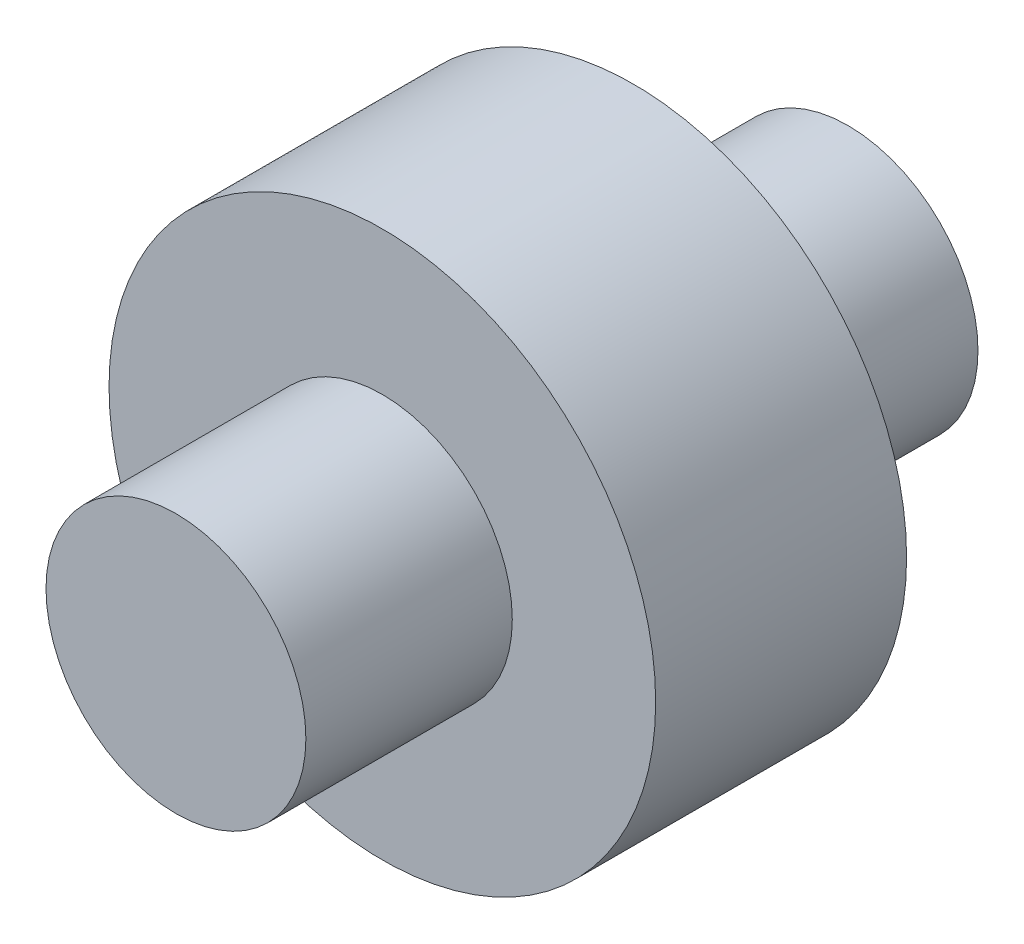
ISO-10303-21;
HEADER;
FILE_DESCRIPTION(('STEP AP214'),'2;1');
FILE_NAME('part.step','',(''),(''),'','','');
FILE_SCHEMA(('AUTOMOTIVE_DESIGN { 1 0 10303 214 1 1 1 1 }'));
ENDSEC;
DATA;
#1=APPLICATION_CONTEXT('core data for automotive mechanical design processes');
#2=APPLICATION_PROTOCOL_DEFINITION('international standard','automotive_design',2000,#1);
#3=PRODUCT_CONTEXT('',#1,'mechanical');
#4=PRODUCT('Part','Part','',(#3));
#5=PRODUCT_RELATED_PRODUCT_CATEGORY('part','',(#4));
#6=PRODUCT_DEFINITION_FORMATION('','',#4);
#7=PRODUCT_DEFINITION_CONTEXT('part definition',#1,'design');
#8=PRODUCT_DEFINITION('design','',#6,#7);
#9=PRODUCT_DEFINITION_SHAPE('','',#8);
#10=(LENGTH_UNIT() NAMED_UNIT(*) SI_UNIT(.MILLI.,.METRE.));
#11=(NAMED_UNIT(*) PLANE_ANGLE_UNIT() SI_UNIT($,.RADIAN.));
#12=(NAMED_UNIT(*) SI_UNIT($,.STERADIAN.) SOLID_ANGLE_UNIT());
#13=UNCERTAINTY_MEASURE_WITH_UNIT(LENGTH_MEASURE(1.E-05),#10,'distance_accuracy_value','');
#14=(GEOMETRIC_REPRESENTATION_CONTEXT(3) GLOBAL_UNCERTAINTY_ASSIGNED_CONTEXT((#13)) GLOBAL_UNIT_ASSIGNED_CONTEXT((#10,
#11,#12)) REPRESENTATION_CONTEXT('',''));
#15=CARTESIAN_POINT('',(0.,0.,0.));
#16=DIRECTION('',(0.,0.,1.));
#17=DIRECTION('',(1.,0.,0.));
#18=AXIS2_PLACEMENT_3D('',#15,#16,#17);
#19=CARTESIAN_POINT('',(0.,1.8415,6.8751656284331));
#20=DIRECTION('',(0.,0.,-1.));
#21=DIRECTION('',(-1.,0.,0.));
#22=AXIS2_PLACEMENT_3D('',#19,#20,#21);
#23=PLANE('',#22);
#24=CARTESIAN_POINT('',(0.,0.,6.8751656284331));
#25=DIRECTION('',(0.,0.,1.));
#26=DIRECTION('',(1.,0.,0.));
#27=AXIS2_PLACEMENT_3D('',#24,#25,#26);
#28=CIRCLE('',#27,1.8415);
#29=CARTESIAN_POINT('',(1.8415,0.,6.8751656284331));
#30=VERTEX_POINT('',#29);
#31=EDGE_CURVE('E54',#30,#30,#28,.T.);
#32=ORIENTED_EDGE('',*,*,#31,.T.);
#33=EDGE_LOOP('',(#32));
#34=FACE_BOUND('',#33,.T.);
#35=ADVANCED_FACE('F32',(#34),#23,.F.);
#36=CARTESIAN_POINT('',(0.,1.8415,-2.6498343715669));
#37=DIRECTION('',(0.,0.,1.));
#38=DIRECTION('',(1.,0.,0.));
#39=AXIS2_PLACEMENT_3D('',#36,#37,#38);
#40=PLANE('',#39);
#41=CARTESIAN_POINT('',(0.,0.,-2.6498343715669));
#42=DIRECTION('',(0.,0.,1.));
#43=DIRECTION('',(1.,0.,0.));
#44=AXIS2_PLACEMENT_3D('',#41,#42,#43);
#45=CIRCLE('',#44,1.8415);
#46=CARTESIAN_POINT('',(1.8415,0.,-2.6498343715669));
#47=VERTEX_POINT('',#46);
#48=EDGE_CURVE('E10',#47,#47,#45,.T.);
#49=ORIENTED_EDGE('',*,*,#48,.F.);
#50=EDGE_LOOP('',(#49));
#51=FACE_BOUND('',#50,.T.);
#52=ADVANCED_FACE('F84',(#51),#40,.F.);
#53=CARTESIAN_POINT('',(0.,0.,6.8751656284331));
#54=DIRECTION('',(0.,0.,1.));
#55=DIRECTION('',(1.,0.,0.));
#56=AXIS2_PLACEMENT_3D('',#53,#54,#55);
#57=CYLINDRICAL_SURFACE('',#56,1.8415);
#58=CARTESIAN_POINT('',(0.,0.,0.393933486760011));
#59=DIRECTION('',(0.,0.,1.));
#60=DIRECTION('',(1.,0.,0.));
#61=AXIS2_PLACEMENT_3D('',#58,#59,#60);
#62=CIRCLE('',#61,1.8415);
#63=CARTESIAN_POINT('',(1.8415,0.,0.393933486760011));
#64=VERTEX_POINT('',#63);
#65=EDGE_CURVE('E38',#64,#64,#62,.T.);
#66=ORIENTED_EDGE('',*,*,#65,.F.);
#67=EDGE_LOOP('',(#66));
#68=FACE_BOUND('',#67,.T.);
#69=ORIENTED_EDGE('',*,*,#48,.T.);
#70=EDGE_LOOP('',(#69));
#71=FACE_BOUND('',#70,.T.);
#72=ADVANCED_FACE('F79',(#68,#71),#57,.T.);
#73=CARTESIAN_POINT('',(0.,3.8735,0.39393348676001));
#74=DIRECTION('',(0.,0.,1.));
#75=DIRECTION('',(1.,0.,0.));
#76=AXIS2_PLACEMENT_3D('',#73,#74,#75);
#77=PLANE('',#76);
#78=CARTESIAN_POINT('',(0.,0.,0.393933486760009));
#79=DIRECTION('',(0.,0.,1.));
#80=DIRECTION('',(1.,0.,0.));
#81=AXIS2_PLACEMENT_3D('',#78,#79,#80);
#82=CIRCLE('',#81,3.8735);
#83=CARTESIAN_POINT('',(3.8735,0.,0.393933486760009));
#84=VERTEX_POINT('',#83);
#85=EDGE_CURVE('E42',#84,#84,#82,.T.);
#86=ORIENTED_EDGE('',*,*,#85,.F.);
#87=EDGE_LOOP('',(#86));
#88=FACE_BOUND('',#87,.T.);
#89=ORIENTED_EDGE('',*,*,#65,.T.);
#90=EDGE_LOOP('',(#89));
#91=FACE_BOUND('',#90,.T.);
#92=ADVANCED_FACE('F74',(#88,#91),#77,.F.);
#93=CARTESIAN_POINT('',(0.,0.,6.8751656284331));
#94=DIRECTION('',(0.,0.,1.));
#95=DIRECTION('',(1.,0.,0.));
#96=AXIS2_PLACEMENT_3D('',#93,#94,#95);
#97=CYLINDRICAL_SURFACE('',#96,3.8735);
#98=CARTESIAN_POINT('',(0.,0.,3.94993348676001));
#99=DIRECTION('',(0.,0.,1.));
#100=DIRECTION('',(1.,0.,0.));
#101=AXIS2_PLACEMENT_3D('',#98,#99,#100);
#102=CIRCLE('',#101,3.8735);
#103=CARTESIAN_POINT('',(3.8735,0.,3.94993348676001));
#104=VERTEX_POINT('',#103);
#105=EDGE_CURVE('E46',#104,#104,#102,.T.);
#106=ORIENTED_EDGE('',*,*,#105,.F.);
#107=EDGE_LOOP('',(#106));
#108=FACE_BOUND('',#107,.T.);
#109=ORIENTED_EDGE('',*,*,#85,.T.);
#110=EDGE_LOOP('',(#109));
#111=FACE_BOUND('',#110,.T.);
#112=ADVANCED_FACE('F68',(#108,#111),#97,.T.);
#113=CARTESIAN_POINT('',(0.,3.8735,3.94993348676001));
#114=DIRECTION('',(0.,0.,-1.));
#115=DIRECTION('',(-1.,0.,0.));
#116=AXIS2_PLACEMENT_3D('',#113,#114,#115);
#117=PLANE('',#116);
#118=CARTESIAN_POINT('',(0.,0.,3.94993348676001));
#119=DIRECTION('',(0.,0.,1.));
#120=DIRECTION('',(1.,0.,0.));
#121=AXIS2_PLACEMENT_3D('',#118,#119,#120);
#122=CIRCLE('',#121,1.8415);
#123=CARTESIAN_POINT('',(1.8415,0.,3.94993348676001));
#124=VERTEX_POINT('',#123);
#125=EDGE_CURVE('E51',#124,#124,#122,.T.);
#126=ORIENTED_EDGE('',*,*,#125,.F.);
#127=EDGE_LOOP('',(#126));
#128=FACE_BOUND('',#127,.T.);
#129=ORIENTED_EDGE('',*,*,#105,.T.);
#130=EDGE_LOOP('',(#129));
#131=FACE_BOUND('',#130,.T.);
#132=ADVANCED_FACE('F62',(#128,#131),#117,.F.);
#133=CARTESIAN_POINT('',(0.,0.,6.8751656284331));
#134=DIRECTION('',(0.,0.,1.));
#135=DIRECTION('',(1.,0.,0.));
#136=AXIS2_PLACEMENT_3D('',#133,#134,#135);
#137=CYLINDRICAL_SURFACE('',#136,1.8415);
#138=ORIENTED_EDGE('',*,*,#31,.F.);
#139=EDGE_LOOP('',(#138));
#140=FACE_BOUND('',#139,.T.);
#141=ORIENTED_EDGE('',*,*,#125,.T.);
#142=EDGE_LOOP('',(#141));
#143=FACE_BOUND('',#142,.T.);
#144=ADVANCED_FACE('F59',(#140,#143),#137,.T.);
#145=CLOSED_SHELL('',(#35,#52,#72,#92,#112,#132,#144));
#146=MANIFOLD_SOLID_BREP('B2',#145);
#147=ADVANCED_BREP_SHAPE_REPRESENTATION('',(#18,#146),#14);
#148=SHAPE_DEFINITION_REPRESENTATION(#9,#147);
ENDSEC;
END-ISO-10303-21;
